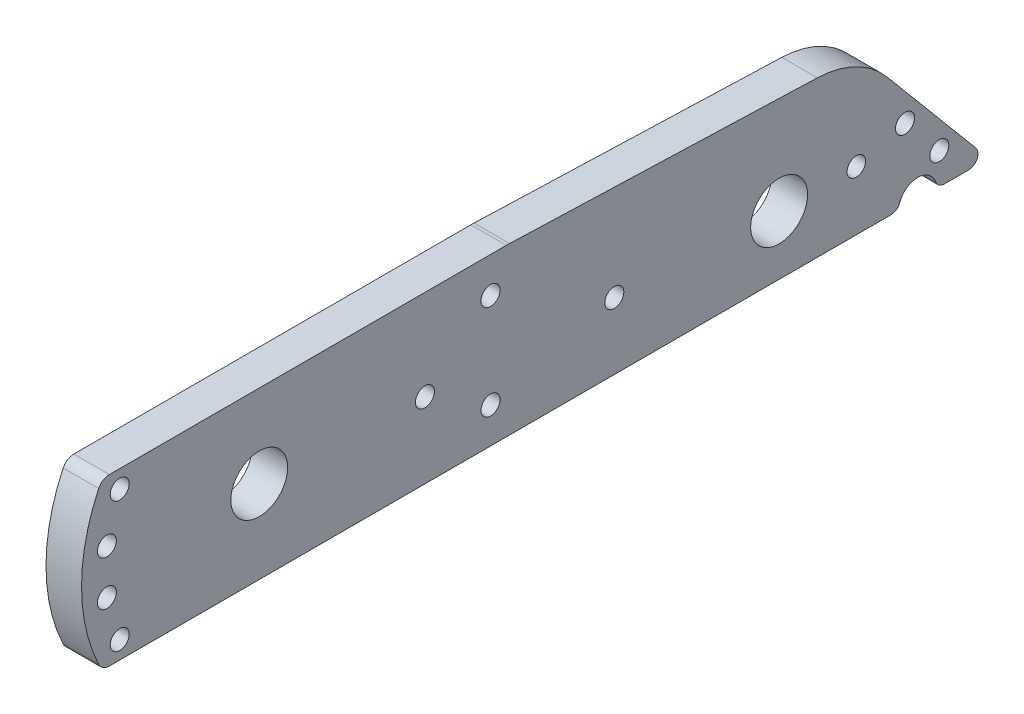
ISO-10303-21;
HEADER;
FILE_DESCRIPTION(('STEP AP214'),'2;1');
FILE_NAME('part.step','',(''),(''),'','','');
FILE_SCHEMA(('AUTOMOTIVE_DESIGN { 1 0 10303 214 1 1 1 1 }'));
ENDSEC;
DATA;
#1=APPLICATION_CONTEXT('core data for automotive mechanical design processes');
#2=APPLICATION_PROTOCOL_DEFINITION('international standard','automotive_design',2000,#1);
#3=PRODUCT_CONTEXT('',#1,'mechanical');
#4=PRODUCT('Part','Part','',(#3));
#5=PRODUCT_RELATED_PRODUCT_CATEGORY('part','',(#4));
#6=PRODUCT_DEFINITION_FORMATION('','',#4);
#7=PRODUCT_DEFINITION_CONTEXT('part definition',#1,'design');
#8=PRODUCT_DEFINITION('design','',#6,#7);
#9=PRODUCT_DEFINITION_SHAPE('','',#8);
#10=(LENGTH_UNIT() NAMED_UNIT(*) SI_UNIT(.MILLI.,.METRE.));
#11=(NAMED_UNIT(*) PLANE_ANGLE_UNIT() SI_UNIT($,.RADIAN.));
#12=(NAMED_UNIT(*) SI_UNIT($,.STERADIAN.) SOLID_ANGLE_UNIT());
#13=UNCERTAINTY_MEASURE_WITH_UNIT(LENGTH_MEASURE(1.E-05),#10,'distance_accuracy_value','');
#14=(GEOMETRIC_REPRESENTATION_CONTEXT(3) GLOBAL_UNCERTAINTY_ASSIGNED_CONTEXT((#13)) GLOBAL_UNIT_ASSIGNED_CONTEXT((#10,
#11,#12)) REPRESENTATION_CONTEXT('',''));
#15=CARTESIAN_POINT('',(0.,0.,0.));
#16=DIRECTION('',(0.,0.,1.));
#17=DIRECTION('',(1.,0.,0.));
#18=AXIS2_PLACEMENT_3D('',#15,#16,#17);
#19=CARTESIAN_POINT('',(-4.7625,9.52500000000001,19.05));
#20=DIRECTION('',(0.,1.,0.));
#21=DIRECTION('',(0.,0.,1.));
#22=AXIS2_PLACEMENT_3D('',#19,#20,#21);
#23=PLANE('',#22);
#24=DIRECTION('',(0.,0.,1.));
#25=VECTOR('',#24,1.);
#26=CARTESIAN_POINT('',(-4.7625,9.52500000000001,-195.537119934818));
#27=LINE('',#26,#25);
#28=CARTESIAN_POINT('',(-4.7625,9.52500000000001,-169.287441577265));
#29=VERTEX_POINT('',#28);
#30=CARTESIAN_POINT('',(-4.7625,9.52500000000001,40.1609262841384));
#31=VERTEX_POINT('',#30);
#32=EDGE_CURVE('E184',#29,#31,#27,.T.);
#33=ORIENTED_EDGE('',*,*,#32,.F.);
#34=DIRECTION('',(1.,0.,0.));
#35=VECTOR('',#34,1.);
#36=CARTESIAN_POINT('',(-4.7625,9.52500000000001,-169.287441577265));
#37=LINE('',#36,#35);
#38=CARTESIAN_POINT('',(4.7625,9.52500000000001,-169.287441577265));
#39=VERTEX_POINT('',#38);
#40=EDGE_CURVE('E11',#29,#39,#37,.T.);
#41=ORIENTED_EDGE('',*,*,#40,.T.);
#42=DIRECTION('',(0.,0.,1.));
#43=VECTOR('',#42,1.);
#44=CARTESIAN_POINT('',(4.7625,9.52500000000001,19.05));
#45=LINE('',#44,#43);
#46=CARTESIAN_POINT('',(4.7625,9.52500000000001,40.1609262841384));
#47=VERTEX_POINT('',#46);
#48=EDGE_CURVE('E168',#39,#47,#45,.T.);
#49=ORIENTED_EDGE('',*,*,#48,.T.);
#50=DIRECTION('',(1.,0.,0.));
#51=VECTOR('',#50,1.);
#52=CARTESIAN_POINT('',(-4.7625,9.52500000000001,40.1609262841384));
#53=LINE('',#52,#51);
#54=EDGE_CURVE('E244',#47,#31,#53,.F.);
#55=ORIENTED_EDGE('',*,*,#54,.T.);
#56=EDGE_LOOP('',(#33,#41,#49,#55));
#57=FACE_BOUND('',#56,.T.);
#58=ADVANCED_FACE('F41',(#57),#23,.F.);
#59=CARTESIAN_POINT('',(-4.7625,31.75,0.));
#60=DIRECTION('',(1.,0.,0.));
#61=DIRECTION('',(0.,0.,-1.));
#62=AXIS2_PLACEMENT_3D('',#59,#60,#61);
#63=PLANE('',#62);
#64=CARTESIAN_POINT('',(-4.7625,49.2125,37.3990202913124));
#65=DIRECTION('',(-1.,0.,0.));
#66=DIRECTION('',(0.,0.,1.));
#67=AXIS2_PLACEMENT_3D('',#64,#65,#66);
#68=CIRCLE('',#67,2.54);
#69=CARTESIAN_POINT('',(-4.7625,49.2125,39.9390202913124));
#70=VERTEX_POINT('',#69);
#71=EDGE_CURVE('E214',#70,#70,#68,.T.);
#72=ORIENTED_EDGE('',*,*,#71,.F.);
#73=EDGE_LOOP('',(#72));
#74=FACE_BOUND('',#73,.T.);
#75=CARTESIAN_POINT('',(-4.7625,37.7389524788158,40.8381938044092));
#76=DIRECTION('',(-1.,0.,0.));
#77=DIRECTION('',(0.,0.,1.));
#78=AXIS2_PLACEMENT_3D('',#75,#76,#77);
#79=CIRCLE('',#78,2.54);
#80=CARTESIAN_POINT('',(-4.7625,37.7389524788158,43.3781938044092));
#81=VERTEX_POINT('',#80);
#82=EDGE_CURVE('E381',#81,#81,#79,.T.);
#83=ORIENTED_EDGE('',*,*,#82,.F.);
#84=EDGE_LOOP('',(#83));
#85=FACE_BOUND('',#84,.T.);
#86=CARTESIAN_POINT('',(-4.7625,25.7610475211842,40.8381938044092));
#87=DIRECTION('',(-1.,0.,0.));
#88=DIRECTION('',(0.,0.,1.));
#89=AXIS2_PLACEMENT_3D('',#86,#87,#88);
#90=CIRCLE('',#89,2.54);
#91=CARTESIAN_POINT('',(-4.7625,25.7610475211842,43.3781938044092));
#92=VERTEX_POINT('',#91);
#93=EDGE_CURVE('E376',#92,#92,#90,.T.);
#94=ORIENTED_EDGE('',*,*,#93,.F.);
#95=EDGE_LOOP('',(#94));
#96=FACE_BOUND('',#95,.T.);
#97=CARTESIAN_POINT('',(-4.7625,14.2875,37.3990202913124));
#98=DIRECTION('',(-1.,0.,0.));
#99=DIRECTION('',(0.,0.,1.));
#100=AXIS2_PLACEMENT_3D('',#97,#98,#99);
#101=CIRCLE('',#100,2.54);
#102=CARTESIAN_POINT('',(-4.7625,14.2875,39.9390202913124));
#103=VERTEX_POINT('',#102);
#104=EDGE_CURVE('E373',#103,#103,#101,.T.);
#105=ORIENTED_EDGE('',*,*,#104,.F.);
#106=EDGE_LOOP('',(#105));
#107=FACE_BOUND('',#106,.T.);
#108=CARTESIAN_POINT('',(-4.7625,28.8892429303716,-173.071588618471));
#109=DIRECTION('',(-1.,0.,0.));
#110=DIRECTION('',(0.,0.,1.));
#111=AXIS2_PLACEMENT_3D('',#108,#109,#110);
#112=CIRCLE('',#111,2.55269999999998);
#113=CARTESIAN_POINT('',(-4.7625,28.8892429303716,-170.518888618471));
#114=VERTEX_POINT('',#113);
#115=EDGE_CURVE('E206',#114,#114,#112,.T.);
#116=ORIENTED_EDGE('',*,*,#115,.F.);
#117=EDGE_LOOP('',(#116));
#118=FACE_BOUND('',#117,.T.);
#119=CARTESIAN_POINT('',(-4.7625,17.9443829493092,-182.255416591868));
#120=DIRECTION('',(-1.,0.,0.));
#121=DIRECTION('',(0.,0.,1.));
#122=AXIS2_PLACEMENT_3D('',#119,#120,#121);
#123=CIRCLE('',#122,2.5526999999999);
#124=CARTESIAN_POINT('',(-4.7625,17.9443829493092,-179.702716591868));
#125=VERTEX_POINT('',#124);
#126=EDGE_CURVE('E222',#125,#125,#123,.T.);
#127=ORIENTED_EDGE('',*,*,#126,.F.);
#128=EDGE_LOOP('',(#127));
#129=FACE_BOUND('',#128,.T.);
#130=CARTESIAN_POINT('',(-4.7625,29.7262338371881,-44.4039060277163));
#131=DIRECTION('',(-1.,0.,0.));
#132=DIRECTION('',(0.,0.,1.));
#133=AXIS2_PLACEMENT_3D('',#130,#131,#132);
#134=CIRCLE('',#133,2.5527);
#135=CARTESIAN_POINT('',(-4.7625,29.7262338371881,-41.8512060277163));
#136=VERTEX_POINT('',#135);
#137=EDGE_CURVE('E189',#136,#136,#134,.T.);
#138=ORIENTED_EDGE('',*,*,#137,.F.);
#139=EDGE_LOOP('',(#138));
#140=FACE_BOUND('',#139,.T.);
#141=CARTESIAN_POINT('',(-4.7625,27.413358222546,-95.1512272022492));
#142=DIRECTION('',(-1.,0.,0.));
#143=DIRECTION('',(0.,0.,1.));
#144=AXIS2_PLACEMENT_3D('',#141,#142,#143);
#145=CIRCLE('',#144,2.55270000000001);
#146=CARTESIAN_POINT('',(-4.7625,27.413358222546,-92.5985272022492));
#147=VERTEX_POINT('',#146);
#148=EDGE_CURVE('E392',#147,#147,#145,.T.);
#149=ORIENTED_EDGE('',*,*,#148,.F.);
#150=EDGE_LOOP('',(#149));
#151=FACE_BOUND('',#150,.T.);
#152=CARTESIAN_POINT('',(-4.7625,44.45,-61.9862019257977));
#153=DIRECTION('',(-1.,0.,0.));
#154=DIRECTION('',(0.,0.,1.));
#155=AXIS2_PLACEMENT_3D('',#152,#153,#154);
#156=CIRCLE('',#155,2.5527);
#157=CARTESIAN_POINT('',(-4.7625,44.45,-59.4335019257977));
#158=VERTEX_POINT('',#157);
#159=EDGE_CURVE('E395',#158,#158,#156,.T.);
#160=ORIENTED_EDGE('',*,*,#159,.F.);
#161=EDGE_LOOP('',(#160));
#162=FACE_BOUND('',#161,.T.);
#163=CARTESIAN_POINT('',(-4.7625,19.05,-61.9862019257977));
#164=DIRECTION('',(-1.,0.,0.));
#165=DIRECTION('',(0.,0.,1.));
#166=AXIS2_PLACEMENT_3D('',#163,#164,#165);
#167=CIRCLE('',#166,2.5527);
#168=CARTESIAN_POINT('',(-4.7625,19.05,-59.4335019257977));
#169=VERTEX_POINT('',#168);
#170=EDGE_CURVE('E398',#169,#169,#167,.T.);
#171=ORIENTED_EDGE('',*,*,#170,.F.);
#172=EDGE_LOOP('',(#171));
#173=FACE_BOUND('',#172,.T.);
#174=CARTESIAN_POINT('',(-4.7625,25.4,-160.02));
#175=DIRECTION('',(-1.,0.,0.));
#176=DIRECTION('',(0.,0.,1.));
#177=AXIS2_PLACEMENT_3D('',#174,#175,#176);
#178=CIRCLE('',#177,2.4892);
#179=CARTESIAN_POINT('',(-4.7625,25.4,-157.5308));
#180=VERTEX_POINT('',#179);
#181=EDGE_CURVE('E209',#180,#180,#178,.T.);
#182=ORIENTED_EDGE('',*,*,#181,.F.);
#183=EDGE_LOOP('',(#182));
#184=FACE_BOUND('',#183,.T.);
#185=CARTESIAN_POINT('',(-4.7625,9.52500000000001,-190.090072356724));
#186=VERTEX_POINT('',#185);
#187=CARTESIAN_POINT('',(-4.7625,9.52500000000001,-183.655851370976));
#188=VERTEX_POINT('',#187);
#189=EDGE_CURVE('E161',#186,#188,#27,.T.);
#190=ORIENTED_EDGE('',*,*,#189,.T.);
#191=CARTESIAN_POINT('',(-4.7625,12.065,-183.655851370976));
#192=DIRECTION('',(1.,0.,0.));
#193=DIRECTION('',(0.,0.,-1.));
#194=AXIS2_PLACEMENT_3D('',#191,#192,#193);
#195=CIRCLE('',#194,2.54);
#196=CARTESIAN_POINT('',(-4.7625,11.2183333333333,-181.261116405357));
#197=VERTEX_POINT('',#196);
#198=EDGE_CURVE('E269',#188,#197,#195,.F.);
#199=ORIENTED_EDGE('',*,*,#198,.T.);
#200=CARTESIAN_POINT('',(-4.7625,9.52500000000001,-176.47164647412));
#201=DIRECTION('',(1.,0.,0.));
#202=DIRECTION('',(0.,0.,-1.));
#203=AXIS2_PLACEMENT_3D('',#200,#201,#202);
#204=CIRCLE('',#203,5.07999999999999);
#205=CARTESIAN_POINT('',(-4.7625,11.2183333333333,-171.682176542884));
#206=VERTEX_POINT('',#205);
#207=EDGE_CURVE('E281',#197,#206,#204,.T.);
#208=ORIENTED_EDGE('',*,*,#207,.T.);
#209=CARTESIAN_POINT('',(-4.7625,12.065,-169.287441577265));
#210=DIRECTION('',(1.,0.,0.));
#211=DIRECTION('',(0.,0.,-1.));
#212=AXIS2_PLACEMENT_3D('',#209,#210,#211);
#213=CIRCLE('',#212,2.54);
#214=EDGE_CURVE('E267',#206,#29,#213,.F.);
#215=ORIENTED_EDGE('',*,*,#214,.T.);
#216=ORIENTED_EDGE('',*,*,#32,.T.);
#217=CARTESIAN_POINT('',(-4.7625,12.7,40.1609262841384));
#218=DIRECTION('',(1.,0.,0.));
#219=DIRECTION('',(0.,0.,-1.));
#220=AXIS2_PLACEMENT_3D('',#217,#218,#219);
#221=CIRCLE('',#220,3.175);
#222=CARTESIAN_POINT('',(-4.7625,11.3392857142857,43.0295638758626));
#223=VERTEX_POINT('',#222);
#224=EDGE_CURVE('E240',#31,#223,#221,.F.);
#225=ORIENTED_EDGE('',*,*,#224,.T.);
#226=CARTESIAN_POINT('',(-4.7625,31.75,0.));
#227=DIRECTION('',(-1.,0.,0.));
#228=DIRECTION('',(0.,0.,-1.));
#229=AXIS2_PLACEMENT_3D('',#226,#227,#228);
#230=CIRCLE('',#229,47.625);
#231=CARTESIAN_POINT('',(-4.7625,52.1607142857143,43.0295638758626));
#232=VERTEX_POINT('',#231);
#233=EDGE_CURVE('E288',#223,#232,#230,.T.);
#234=ORIENTED_EDGE('',*,*,#233,.T.);
#235=CARTESIAN_POINT('',(-4.7625,50.8,40.1609262841384));
#236=DIRECTION('',(1.,0.,0.));
#237=DIRECTION('',(0.,0.,-1.));
#238=AXIS2_PLACEMENT_3D('',#235,#236,#237);
#239=CIRCLE('',#238,3.175);
#240=CARTESIAN_POINT('',(-4.7625,53.975,40.1609262841384));
#241=VERTEX_POINT('',#240);
#242=EDGE_CURVE('E242',#232,#241,#239,.F.);
#243=ORIENTED_EDGE('',*,*,#242,.T.);
#244=DIRECTION('',(0.,0.,-1.));
#245=VECTOR('',#244,1.);
#246=CARTESIAN_POINT('',(-4.7625,53.975,19.05));
#247=LINE('',#246,#245);
#248=CARTESIAN_POINT('',(-4.7625,53.975,-66.2471978534933));
#249=VERTEX_POINT('',#248);
#250=EDGE_CURVE('E291',#241,#249,#247,.T.);
#251=ORIENTED_EDGE('',*,*,#250,.T.);
#252=CARTESIAN_POINT('',(-4.7625,28.575,-66.2471978534933));
#253=DIRECTION('',(1.,0.,0.));
#254=DIRECTION('',(0.,0.,-1.));
#255=AXIS2_PLACEMENT_3D('',#252,#253,#254);
#256=CIRCLE('',#255,25.4);
#257=CARTESIAN_POINT('',(-4.7625,53.9605934822915,-67.102559503231));
#258=VERTEX_POINT('',#257);
#259=EDGE_CURVE('E259',#249,#258,#256,.F.);
#260=ORIENTED_EDGE('',*,*,#259,.T.);
#261=DIRECTION('',(0.,-0.0336756555014838,-0.999432814263443));
#262=VECTOR('',#261,1.);
#263=CARTESIAN_POINT('',(-4.7625,50.8,-160.903282657976));
#264=LINE('',#263,#262);
#265=CARTESIAN_POINT('',(-4.7625,51.181459251911,-149.582258969293));
#266=VERTEX_POINT('',#265);
#267=EDGE_CURVE('E298',#258,#266,#264,.T.);
#268=ORIENTED_EDGE('',*,*,#267,.T.);
#269=CARTESIAN_POINT('',(-4.7625,25.7958657696195,-148.726897319555));
#270=DIRECTION('',(1.,0.,0.));
#271=DIRECTION('',(0.,0.,-1.));
#272=AXIS2_PLACEMENT_3D('',#269,#270,#271);
#273=CIRCLE('',#272,25.4);
#274=CARTESIAN_POINT('',(-4.7625,42.1226710556577,-168.184426174777));
#275=VERTEX_POINT('',#274);
#276=EDGE_CURVE('E261',#266,#275,#273,.F.);
#277=ORIENTED_EDGE('',*,*,#276,.T.);
#278=DIRECTION('',(0.,-0.766044443118974,-0.642787609686544));
#279=VECTOR('',#278,1.);
#280=CARTESIAN_POINT('',(-4.7625,9.52500000000001,-195.537119934818));
#281=LINE('',#280,#279);
#282=CARTESIAN_POINT('',(-4.7625,13.6976805286038,-192.035825242246));
#283=VERTEX_POINT('',#282);
#284=EDGE_CURVE('E162',#275,#283,#281,.T.);
#285=ORIENTED_EDGE('',*,*,#284,.T.);
#286=CARTESIAN_POINT('',(-4.7625,12.065,-190.090072356724));
#287=DIRECTION('',(1.,0.,0.));
#288=DIRECTION('',(0.,0.,-1.));
#289=AXIS2_PLACEMENT_3D('',#286,#287,#288);
#290=CIRCLE('',#289,2.54);
#291=EDGE_CURVE('E225',#283,#186,#290,.F.);
#292=ORIENTED_EDGE('',*,*,#291,.T.);
#293=EDGE_LOOP('',(#190,#199,#208,#215,#216,#225,#234,#243,#251,#260,#268,#277,#285,#292));
#294=FACE_BOUND('',#293,.T.);
#295=CARTESIAN_POINT('',(-4.7625,31.75,0.));
#296=DIRECTION('',(-1.,0.,0.));
#297=DIRECTION('',(0.,0.,1.));
#298=AXIS2_PLACEMENT_3D('',#295,#296,#297);
#299=CIRCLE('',#298,7.62);
#300=CARTESIAN_POINT('',(-4.7625,31.75,-7.62));
#301=VERTEX_POINT('',#300);
#302=EDGE_CURVE('E173',#301,#301,#299,.T.);
#303=ORIENTED_EDGE('',*,*,#302,.F.);
#304=EDGE_LOOP('',(#303));
#305=FACE_BOUND('',#304,.T.);
#306=CARTESIAN_POINT('',(-4.7625,25.4,-139.32677028468));
#307=DIRECTION('',(-1.,0.,0.));
#308=DIRECTION('',(0.,0.,1.));
#309=AXIS2_PLACEMENT_3D('',#306,#307,#308);
#310=CIRCLE('',#309,7.62);
#311=CARTESIAN_POINT('',(-4.7625,25.4,-146.94677028468));
#312=VERTEX_POINT('',#311);
#313=EDGE_CURVE('E403',#312,#312,#310,.T.);
#314=ORIENTED_EDGE('',*,*,#313,.F.);
#315=EDGE_LOOP('',(#314));
#316=FACE_BOUND('',#315,.T.);
#317=ADVANCED_FACE('F286',(#74,#85,#96,#107,#118,#129,#140,#151,#162,#173,#184,#294,#305,#316),
#63,.F.);
#318=CARTESIAN_POINT('',(4.7625,31.75,0.));
#319=DIRECTION('',(1.,0.,0.));
#320=DIRECTION('',(0.,0.,-1.));
#321=AXIS2_PLACEMENT_3D('',#318,#319,#320);
#322=PLANE('',#321);
#323=CARTESIAN_POINT('',(4.7625,9.52500000000001,-176.47164647412));
#324=DIRECTION('',(1.,0.,0.));
#325=DIRECTION('',(0.,0.,-1.));
#326=AXIS2_PLACEMENT_3D('',#323,#324,#325);
#327=CIRCLE('',#326,5.07999999999999);
#328=CARTESIAN_POINT('',(4.7625,11.2183333333333,-181.261116405357));
#329=VERTEX_POINT('',#328);
#330=CARTESIAN_POINT('',(4.7625,11.2183333333333,-171.682176542884));
#331=VERTEX_POINT('',#330);
#332=EDGE_CURVE('E279',#329,#331,#327,.T.);
#333=ORIENTED_EDGE('',*,*,#332,.F.);
#334=CARTESIAN_POINT('',(4.7625,12.065,-183.655851370976));
#335=DIRECTION('',(1.,0.,0.));
#336=DIRECTION('',(0.,0.,-1.));
#337=AXIS2_PLACEMENT_3D('',#334,#335,#336);
#338=CIRCLE('',#337,2.54);
#339=CARTESIAN_POINT('',(4.7625,9.52500000000001,-183.655851370976));
#340=VERTEX_POINT('',#339);
#341=EDGE_CURVE('E49',#329,#340,#338,.T.);
#342=ORIENTED_EDGE('',*,*,#341,.T.);
#343=CARTESIAN_POINT('',(4.7625,9.52500000000001,-190.090072356724));
#344=VERTEX_POINT('',#343);
#345=EDGE_CURVE('E158',#344,#340,#45,.T.);
#346=ORIENTED_EDGE('',*,*,#345,.F.);
#347=CARTESIAN_POINT('',(4.7625,12.065,-190.090072356724));
#348=DIRECTION('',(1.,0.,0.));
#349=DIRECTION('',(0.,0.,-1.));
#350=AXIS2_PLACEMENT_3D('',#347,#348,#349);
#351=CIRCLE('',#350,2.54);
#352=CARTESIAN_POINT('',(4.7625,13.6976805286038,-192.035825242246));
#353=VERTEX_POINT('',#352);
#354=EDGE_CURVE('E143',#344,#353,#351,.T.);
#355=ORIENTED_EDGE('',*,*,#354,.T.);
#356=DIRECTION('',(0.,-0.766044443118974,-0.642787609686544));
#357=VECTOR('',#356,1.);
#358=CARTESIAN_POINT('',(4.7625,9.52500000000001,-195.537119934818));
#359=LINE('',#358,#357);
#360=CARTESIAN_POINT('',(4.7625,42.1226710556577,-168.184426174777));
#361=VERTEX_POINT('',#360);
#362=EDGE_CURVE('E182',#361,#353,#359,.T.);
#363=ORIENTED_EDGE('',*,*,#362,.F.);
#364=CARTESIAN_POINT('',(4.7625,25.7958657696195,-148.726897319555));
#365=DIRECTION('',(1.,0.,0.));
#366=DIRECTION('',(0.,0.,-1.));
#367=AXIS2_PLACEMENT_3D('',#364,#365,#366);
#368=CIRCLE('',#367,25.4);
#369=CARTESIAN_POINT('',(4.7625,51.181459251911,-149.582258969293));
#370=VERTEX_POINT('',#369);
#371=EDGE_CURVE('E252',#361,#370,#368,.T.);
#372=ORIENTED_EDGE('',*,*,#371,.T.);
#373=DIRECTION('',(0.,-0.0336756555014838,-0.999432814263443));
#374=VECTOR('',#373,1.);
#375=CARTESIAN_POINT('',(4.7625,50.8,-160.903282657976));
#376=LINE('',#375,#374);
#377=CARTESIAN_POINT('',(4.7625,53.9605934822915,-67.102559503231));
#378=VERTEX_POINT('',#377);
#379=EDGE_CURVE('E179',#378,#370,#376,.T.);
#380=ORIENTED_EDGE('',*,*,#379,.F.);
#381=CARTESIAN_POINT('',(4.7625,28.575,-66.2471978534933));
#382=DIRECTION('',(1.,0.,0.));
#383=DIRECTION('',(0.,0.,-1.));
#384=AXIS2_PLACEMENT_3D('',#381,#382,#383);
#385=CIRCLE('',#384,25.4);
#386=CARTESIAN_POINT('',(4.7625,53.975,-66.2471978534933));
#387=VERTEX_POINT('',#386);
#388=EDGE_CURVE('E250',#378,#387,#385,.T.);
#389=ORIENTED_EDGE('',*,*,#388,.T.);
#390=DIRECTION('',(0.,0.,-1.));
#391=VECTOR('',#390,1.);
#392=CARTESIAN_POINT('',(4.7625,53.975,-66.675));
#393=LINE('',#392,#391);
#394=CARTESIAN_POINT('',(4.7625,53.975,40.1609262841384));
#395=VERTEX_POINT('',#394);
#396=EDGE_CURVE('E171',#395,#387,#393,.T.);
#397=ORIENTED_EDGE('',*,*,#396,.F.);
#398=CARTESIAN_POINT('',(4.7625,50.8,40.1609262841384));
#399=DIRECTION('',(1.,0.,0.));
#400=DIRECTION('',(0.,0.,-1.));
#401=AXIS2_PLACEMENT_3D('',#398,#399,#400);
#402=CIRCLE('',#401,3.175);
#403=CARTESIAN_POINT('',(4.7625,52.1607142857143,43.0295638758626));
#404=VERTEX_POINT('',#403);
#405=EDGE_CURVE('E233',#395,#404,#402,.T.);
#406=ORIENTED_EDGE('',*,*,#405,.T.);
#407=CARTESIAN_POINT('',(4.7625,31.75,0.));
#408=DIRECTION('',(-1.,0.,0.));
#409=DIRECTION('',(0.,0.,-1.));
#410=AXIS2_PLACEMENT_3D('',#407,#408,#409);
#411=CIRCLE('',#410,47.625);
#412=CARTESIAN_POINT('',(4.7625,11.3392857142857,43.0295638758626));
#413=VERTEX_POINT('',#412);
#414=EDGE_CURVE('E167',#413,#404,#411,.T.);
#415=ORIENTED_EDGE('',*,*,#414,.F.);
#416=CARTESIAN_POINT('',(4.7625,12.7,40.1609262841384));
#417=DIRECTION('',(1.,0.,0.));
#418=DIRECTION('',(0.,0.,-1.));
#419=AXIS2_PLACEMENT_3D('',#416,#417,#418);
#420=CIRCLE('',#419,3.175);
#421=EDGE_CURVE('E230',#413,#47,#420,.T.);
#422=ORIENTED_EDGE('',*,*,#421,.T.);
#423=ORIENTED_EDGE('',*,*,#48,.F.);
#424=CARTESIAN_POINT('',(4.7625,12.065,-169.287441577265));
#425=DIRECTION('',(1.,0.,0.));
#426=DIRECTION('',(0.,0.,-1.));
#427=AXIS2_PLACEMENT_3D('',#424,#425,#426);
#428=CIRCLE('',#427,2.54);
#429=EDGE_CURVE('E56',#39,#331,#428,.T.);
#430=ORIENTED_EDGE('',*,*,#429,.T.);
#431=EDGE_LOOP('',(#333,#342,#346,#355,#363,#372,#380,#389,#397,#406,#415,#422,#423,#430));
#432=FACE_BOUND('',#431,.T.);
#433=CARTESIAN_POINT('',(4.7625,49.2125,37.3990202913124));
#434=DIRECTION('',(1.,0.,0.));
#435=DIRECTION('',(0.,0.,-1.));
#436=AXIS2_PLACEMENT_3D('',#433,#434,#435);
#437=CIRCLE('',#436,2.54);
#438=CARTESIAN_POINT('',(4.7625,49.2125,34.8590202913124));
#439=VERTEX_POINT('',#438);
#440=EDGE_CURVE('E220',#439,#439,#437,.T.);
#441=ORIENTED_EDGE('',*,*,#440,.F.);
#442=EDGE_LOOP('',(#441));
#443=FACE_BOUND('',#442,.T.);
#444=CARTESIAN_POINT('',(4.7625,37.7389524788158,40.8381938044092));
#445=DIRECTION('',(1.,0.,0.));
#446=DIRECTION('',(0.,0.,-1.));
#447=AXIS2_PLACEMENT_3D('',#444,#445,#446);
#448=CIRCLE('',#447,2.54);
#449=CARTESIAN_POINT('',(4.7625,37.7389524788158,38.2981938044092));
#450=VERTEX_POINT('',#449);
#451=EDGE_CURVE('E217',#450,#450,#448,.T.);
#452=ORIENTED_EDGE('',*,*,#451,.F.);
#453=EDGE_LOOP('',(#452));
#454=FACE_BOUND('',#453,.T.);
#455=CARTESIAN_POINT('',(4.7625,25.7610475211842,40.8381938044092));
#456=DIRECTION('',(1.,0.,0.));
#457=DIRECTION('',(0.,0.,-1.));
#458=AXIS2_PLACEMENT_3D('',#455,#456,#457);
#459=CIRCLE('',#458,2.54);
#460=CARTESIAN_POINT('',(4.7625,25.7610475211842,38.2981938044092));
#461=VERTEX_POINT('',#460);
#462=EDGE_CURVE('E213',#461,#461,#459,.T.);
#463=ORIENTED_EDGE('',*,*,#462,.F.);
#464=EDGE_LOOP('',(#463));
#465=FACE_BOUND('',#464,.T.);
#466=CARTESIAN_POINT('',(4.7625,14.2875,37.3990202913124));
#467=DIRECTION('',(1.,0.,0.));
#468=DIRECTION('',(0.,0.,-1.));
#469=AXIS2_PLACEMENT_3D('',#466,#467,#468);
#470=CIRCLE('',#469,2.54);
#471=CARTESIAN_POINT('',(4.7625,14.2875,34.8590202913124));
#472=VERTEX_POINT('',#471);
#473=EDGE_CURVE('E210',#472,#472,#470,.T.);
#474=ORIENTED_EDGE('',*,*,#473,.F.);
#475=EDGE_LOOP('',(#474));
#476=FACE_BOUND('',#475,.T.);
#477=CARTESIAN_POINT('',(4.7625,28.8892429303716,-173.071588618471));
#478=DIRECTION('',(1.,0.,0.));
#479=DIRECTION('',(0.,0.,-1.));
#480=AXIS2_PLACEMENT_3D('',#477,#478,#479);
#481=CIRCLE('',#480,2.55269999999998);
#482=CARTESIAN_POINT('',(4.7625,28.8892429303716,-175.624288618471));
#483=VERTEX_POINT('',#482);
#484=EDGE_CURVE('E205',#483,#483,#481,.T.);
#485=ORIENTED_EDGE('',*,*,#484,.F.);
#486=EDGE_LOOP('',(#485));
#487=FACE_BOUND('',#486,.T.);
#488=CARTESIAN_POINT('',(4.7625,17.9443829493092,-182.255416591868));
#489=DIRECTION('',(1.,0.,0.));
#490=DIRECTION('',(0.,0.,-1.));
#491=AXIS2_PLACEMENT_3D('',#488,#489,#490);
#492=CIRCLE('',#491,2.5526999999999);
#493=CARTESIAN_POINT('',(4.7625,17.9443829493092,-184.808116591868));
#494=VERTEX_POINT('',#493);
#495=EDGE_CURVE('E202',#494,#494,#492,.T.);
#496=ORIENTED_EDGE('',*,*,#495,.F.);
#497=EDGE_LOOP('',(#496));
#498=FACE_BOUND('',#497,.T.);
#499=CARTESIAN_POINT('',(4.7625,29.7262338371881,-44.4039060277163));
#500=DIRECTION('',(1.,0.,0.));
#501=DIRECTION('',(0.,0.,-1.));
#502=AXIS2_PLACEMENT_3D('',#499,#500,#501);
#503=CIRCLE('',#502,2.5527);
#504=CARTESIAN_POINT('',(4.7625,29.7262338371881,-46.9566060277163));
#505=VERTEX_POINT('',#504);
#506=EDGE_CURVE('E198',#505,#505,#503,.T.);
#507=ORIENTED_EDGE('',*,*,#506,.F.);
#508=EDGE_LOOP('',(#507));
#509=FACE_BOUND('',#508,.T.);
#510=CARTESIAN_POINT('',(4.7625,27.413358222546,-95.1512272022492));
#511=DIRECTION('',(1.,0.,0.));
#512=DIRECTION('',(0.,0.,-1.));
#513=AXIS2_PLACEMENT_3D('',#510,#511,#512);
#514=CIRCLE('',#513,2.55270000000001);
#515=CARTESIAN_POINT('',(4.7625,27.413358222546,-97.7039272022492));
#516=VERTEX_POINT('',#515);
#517=EDGE_CURVE('E195',#516,#516,#514,.T.);
#518=ORIENTED_EDGE('',*,*,#517,.F.);
#519=EDGE_LOOP('',(#518));
#520=FACE_BOUND('',#519,.T.);
#521=CARTESIAN_POINT('',(4.7625,44.45,-61.9862019257977));
#522=DIRECTION('',(1.,0.,0.));
#523=DIRECTION('',(0.,0.,-1.));
#524=AXIS2_PLACEMENT_3D('',#521,#522,#523);
#525=CIRCLE('',#524,2.5527);
#526=CARTESIAN_POINT('',(4.7625,44.45,-64.5389019257977));
#527=VERTEX_POINT('',#526);
#528=EDGE_CURVE('E192',#527,#527,#525,.T.);
#529=ORIENTED_EDGE('',*,*,#528,.F.);
#530=EDGE_LOOP('',(#529));
#531=FACE_BOUND('',#530,.T.);
#532=CARTESIAN_POINT('',(4.7625,19.05,-61.9862019257977));
#533=DIRECTION('',(1.,0.,0.));
#534=DIRECTION('',(0.,0.,-1.));
#535=AXIS2_PLACEMENT_3D('',#532,#533,#534);
#536=CIRCLE('',#535,2.5527);
#537=CARTESIAN_POINT('',(4.7625,19.05,-64.5389019257977));
#538=VERTEX_POINT('',#537);
#539=EDGE_CURVE('E188',#538,#538,#536,.T.);
#540=ORIENTED_EDGE('',*,*,#539,.F.);
#541=EDGE_LOOP('',(#540));
#542=FACE_BOUND('',#541,.T.);
#543=CARTESIAN_POINT('',(4.7625,25.4,-160.02));
#544=DIRECTION('',(1.,0.,0.));
#545=DIRECTION('',(0.,0.,-1.));
#546=AXIS2_PLACEMENT_3D('',#543,#544,#545);
#547=CIRCLE('',#546,2.4892);
#548=CARTESIAN_POINT('',(4.7625,25.4,-162.5092));
#549=VERTEX_POINT('',#548);
#550=EDGE_CURVE('E185',#549,#549,#547,.T.);
#551=ORIENTED_EDGE('',*,*,#550,.F.);
#552=EDGE_LOOP('',(#551));
#553=FACE_BOUND('',#552,.T.);
#554=CARTESIAN_POINT('',(4.7625,31.75,0.));
#555=DIRECTION('',(-1.,0.,0.));
#556=DIRECTION('',(0.,0.,1.));
#557=AXIS2_PLACEMENT_3D('',#554,#555,#556);
#558=CIRCLE('',#557,7.62);
#559=CARTESIAN_POINT('',(4.7625,31.75,-7.62));
#560=VERTEX_POINT('',#559);
#561=EDGE_CURVE('E294',#560,#560,#558,.T.);
#562=ORIENTED_EDGE('',*,*,#561,.T.);
#563=EDGE_LOOP('',(#562));
#564=FACE_BOUND('',#563,.T.);
#565=CARTESIAN_POINT('',(4.7625,25.4,-139.32677028468));
#566=DIRECTION('',(-1.,0.,0.));
#567=DIRECTION('',(0.,0.,1.));
#568=AXIS2_PLACEMENT_3D('',#565,#566,#567);
#569=CIRCLE('',#568,7.62);
#570=CARTESIAN_POINT('',(4.7625,25.4,-146.94677028468));
#571=VERTEX_POINT('',#570);
#572=EDGE_CURVE('E201',#571,#571,#569,.T.);
#573=ORIENTED_EDGE('',*,*,#572,.T.);
#574=EDGE_LOOP('',(#573));
#575=FACE_BOUND('',#574,.T.);
#576=ADVANCED_FACE('F164',(#432,#443,#454,#465,#476,#487,#498,#509,#520,#531,#542,#553,#564,
#575),#322,.T.);
#577=ORIENTED_EDGE('',*,*,#345,.T.);
#578=DIRECTION('',(1.,0.,0.));
#579=VECTOR('',#578,1.);
#580=CARTESIAN_POINT('',(-4.7625,9.52500000000001,-183.655851370976));
#581=LINE('',#580,#579);
#582=EDGE_CURVE('E265',#340,#188,#581,.F.);
#583=ORIENTED_EDGE('',*,*,#582,.T.);
#584=ORIENTED_EDGE('',*,*,#189,.F.);
#585=DIRECTION('',(1.,0.,0.));
#586=VECTOR('',#585,1.);
#587=CARTESIAN_POINT('',(-4.7625,9.52500000000001,-190.090072356724));
#588=LINE('',#587,#586);
#589=EDGE_CURVE('E147',#186,#344,#588,.T.);
#590=ORIENTED_EDGE('',*,*,#589,.T.);
#591=EDGE_LOOP('',(#577,#583,#584,#590));
#592=FACE_BOUND('',#591,.T.);
#593=ADVANCED_FACE('F156',(#592),#23,.F.);
#594=CARTESIAN_POINT('',(-4.7625,31.75,0.));
#595=DIRECTION('',(1.,0.,0.));
#596=DIRECTION('',(0.,0.,-1.));
#597=AXIS2_PLACEMENT_3D('',#594,#595,#596);
#598=CYLINDRICAL_SURFACE('',#597,47.625);
#599=ORIENTED_EDGE('',*,*,#414,.T.);
#600=DIRECTION('',(1.,0.,0.));
#601=VECTOR('',#600,1.);
#602=CARTESIAN_POINT('',(-4.7625,52.1607142857143,43.0295638758626));
#603=LINE('',#602,#601);
#604=EDGE_CURVE('E238',#404,#232,#603,.F.);
#605=ORIENTED_EDGE('',*,*,#604,.T.);
#606=ORIENTED_EDGE('',*,*,#233,.F.);
#607=DIRECTION('',(1.,0.,0.));
#608=VECTOR('',#607,1.);
#609=CARTESIAN_POINT('',(-4.7625,11.3392857142857,43.0295638758626));
#610=LINE('',#609,#608);
#611=EDGE_CURVE('E235',#223,#413,#610,.T.);
#612=ORIENTED_EDGE('',*,*,#611,.T.);
#613=EDGE_LOOP('',(#599,#605,#606,#612));
#614=FACE_BOUND('',#613,.T.);
#615=ADVANCED_FACE('F338',(#614),#598,.T.);
#616=CARTESIAN_POINT('',(-4.7625,53.975,-66.675));
#617=DIRECTION('',(0.,-1.,0.));
#618=DIRECTION('',(0.,0.,-1.));
#619=AXIS2_PLACEMENT_3D('',#616,#617,#618);
#620=PLANE('',#619);
#621=ORIENTED_EDGE('',*,*,#396,.T.);
#622=DIRECTION('',(1.,0.,0.));
#623=VECTOR('',#622,1.);
#624=CARTESIAN_POINT('',(-4.7625,53.975,-66.2471978534933));
#625=LINE('',#624,#623);
#626=EDGE_CURVE('E263',#387,#249,#625,.F.);
#627=ORIENTED_EDGE('',*,*,#626,.T.);
#628=ORIENTED_EDGE('',*,*,#250,.F.);
#629=DIRECTION('',(1.,0.,0.));
#630=VECTOR('',#629,1.);
#631=CARTESIAN_POINT('',(-4.7625,53.975,40.1609262841384));
#632=LINE('',#631,#630);
#633=EDGE_CURVE('E227',#241,#395,#632,.T.);
#634=ORIENTED_EDGE('',*,*,#633,.T.);
#635=EDGE_LOOP('',(#621,#627,#628,#634));
#636=FACE_BOUND('',#635,.T.);
#637=ADVANCED_FACE('F343',(#636),#620,.F.);
#638=CARTESIAN_POINT('',(-4.7625,50.8,-160.903282657976));
#639=DIRECTION('',(0.,-0.999432814263443,0.0336756555014838));
#640=DIRECTION('',(0.,-0.0336756555014838,-0.999432814263443));
#641=AXIS2_PLACEMENT_3D('',#638,#639,#640);
#642=PLANE('',#641);
#643=ORIENTED_EDGE('',*,*,#379,.T.);
#644=DIRECTION('',(1.,0.,0.));
#645=VECTOR('',#644,1.);
#646=CARTESIAN_POINT('',(-4.7625,51.181459251911,-149.582258969293));
#647=LINE('',#646,#645);
#648=EDGE_CURVE('E257',#370,#266,#647,.F.);
#649=ORIENTED_EDGE('',*,*,#648,.T.);
#650=ORIENTED_EDGE('',*,*,#267,.F.);
#651=DIRECTION('',(1.,0.,0.));
#652=VECTOR('',#651,1.);
#653=CARTESIAN_POINT('',(-4.7625,53.9605934822915,-67.102559503231));
#654=LINE('',#653,#652);
#655=EDGE_CURVE('E254',#258,#378,#654,.T.);
#656=ORIENTED_EDGE('',*,*,#655,.T.);
#657=EDGE_LOOP('',(#643,#649,#650,#656));
#658=FACE_BOUND('',#657,.T.);
#659=ADVANCED_FACE('F310',(#658),#642,.F.);
#660=CARTESIAN_POINT('',(-4.7625,9.52500000000001,-195.537119934818));
#661=DIRECTION('',(0.,-0.642787609686544,0.766044443118974));
#662=DIRECTION('',(0.,-0.766044443118974,-0.642787609686544));
#663=AXIS2_PLACEMENT_3D('',#660,#661,#662);
#664=PLANE('',#663);
#665=ORIENTED_EDGE('',*,*,#284,.F.);
#666=DIRECTION('',(1.,0.,0.));
#667=VECTOR('',#666,1.);
#668=CARTESIAN_POINT('',(-4.7625,42.1226710556577,-168.184426174777));
#669=LINE('',#668,#667);
#670=EDGE_CURVE('E247',#275,#361,#669,.T.);
#671=ORIENTED_EDGE('',*,*,#670,.T.);
#672=ORIENTED_EDGE('',*,*,#362,.T.);
#673=DIRECTION('',(1.,0.,0.));
#674=VECTOR('',#673,1.);
#675=CARTESIAN_POINT('',(-4.7625,13.6976805286038,-192.035825242246));
#676=LINE('',#675,#674);
#677=EDGE_CURVE('E149',#353,#283,#676,.F.);
#678=ORIENTED_EDGE('',*,*,#677,.T.);
#679=EDGE_LOOP('',(#665,#671,#672,#678));
#680=FACE_BOUND('',#679,.T.);
#681=ADVANCED_FACE('F305',(#680),#664,.F.);
#682=CARTESIAN_POINT('',(-4.7625,31.75,0.));
#683=DIRECTION('',(1.,0.,0.));
#684=DIRECTION('',(0.,0.,-1.));
#685=AXIS2_PLACEMENT_3D('',#682,#683,#684);
#686=CYLINDRICAL_SURFACE('',#685,7.62);
#687=CARTESIAN_POINT('',(-4.7625,31.75,-7.62));
#688=CARTESIAN_POINT('',(-4.66328125,31.75,-7.62));
#689=CARTESIAN_POINT('',(-4.5640625,31.75,-7.62));
#690=CARTESIAN_POINT('',(-4.365625,31.75,-7.62));
#691=CARTESIAN_POINT('',(-4.26640625,31.75,-7.62));
#692=CARTESIAN_POINT('',(-4.06796875,31.75,-7.62));
#693=CARTESIAN_POINT('',(-3.96875,31.75,-7.62));
#694=CARTESIAN_POINT('',(-3.7703125,31.75,-7.62));
#695=CARTESIAN_POINT('',(-3.67109375,31.75,-7.62));
#696=CARTESIAN_POINT('',(-3.47265625,31.75,-7.62));
#697=CARTESIAN_POINT('',(-3.3734375,31.75,-7.62));
#698=CARTESIAN_POINT('',(-3.175,31.75,-7.62));
#699=CARTESIAN_POINT('',(-3.07578125,31.75,-7.62));
#700=CARTESIAN_POINT('',(-2.87734375,31.75,-7.62));
#701=CARTESIAN_POINT('',(-2.778125,31.75,-7.62));
#702=CARTESIAN_POINT('',(-2.5796875,31.75,-7.62));
#703=CARTESIAN_POINT('',(-2.48046875,31.75,-7.62));
#704=CARTESIAN_POINT('',(-2.28203125,31.75,-7.62));
#705=CARTESIAN_POINT('',(-2.1828125,31.75,-7.62));
#706=CARTESIAN_POINT('',(-1.984375,31.75,-7.62));
#707=CARTESIAN_POINT('',(-1.88515625,31.75,-7.62));
#708=CARTESIAN_POINT('',(-1.68671875,31.75,-7.62));
#709=CARTESIAN_POINT('',(-1.5875,31.75,-7.62));
#710=CARTESIAN_POINT('',(-1.3890625,31.75,-7.62));
#711=CARTESIAN_POINT('',(-1.28984375,31.75,-7.62));
#712=CARTESIAN_POINT('',(-1.09140625,31.75,-7.62));
#713=CARTESIAN_POINT('',(-0.992187499999999,31.75,-7.62));
#714=CARTESIAN_POINT('',(-0.793749999999999,31.75,-7.62));
#715=CARTESIAN_POINT('',(-0.694531249999999,31.75,-7.62));
#716=CARTESIAN_POINT('',(-0.496093749999999,31.75,-7.62));
#717=CARTESIAN_POINT('',(-0.396874999999999,31.75,-7.62));
#718=CARTESIAN_POINT('',(-0.198437499999999,31.75,-7.62));
#719=CARTESIAN_POINT('',(-0.0992187499999992,31.75,-7.62));
#720=CARTESIAN_POINT('',(0.0992187500000009,31.75,-7.62));
#721=CARTESIAN_POINT('',(0.198437500000001,31.75,-7.62));
#722=CARTESIAN_POINT('',(0.396875000000001,31.75,-7.62));
#723=CARTESIAN_POINT('',(0.496093750000001,31.75,-7.62));
#724=CARTESIAN_POINT('',(0.694531250000001,31.75,-7.62));
#725=CARTESIAN_POINT('',(0.793750000000001,31.75,-7.62));
#726=CARTESIAN_POINT('',(0.992187500000002,31.75,-7.62));
#727=CARTESIAN_POINT('',(1.09140625,31.75,-7.62));
#728=CARTESIAN_POINT('',(1.28984375,31.75,-7.62));
#729=CARTESIAN_POINT('',(1.3890625,31.75,-7.62));
#730=CARTESIAN_POINT('',(1.5875,31.75,-7.62));
#731=CARTESIAN_POINT('',(1.68671875,31.75,-7.62));
#732=CARTESIAN_POINT('',(1.88515625,31.75,-7.62));
#733=CARTESIAN_POINT('',(1.984375,31.75,-7.62));
#734=CARTESIAN_POINT('',(2.1828125,31.75,-7.62));
#735=CARTESIAN_POINT('',(2.28203125,31.75,-7.62));
#736=CARTESIAN_POINT('',(2.48046875,31.75,-7.62));
#737=CARTESIAN_POINT('',(2.5796875,31.75,-7.62));
#738=CARTESIAN_POINT('',(2.778125,31.75,-7.62));
#739=CARTESIAN_POINT('',(2.87734375,31.75,-7.62));
#740=CARTESIAN_POINT('',(3.07578125,31.75,-7.62));
#741=CARTESIAN_POINT('',(3.175,31.75,-7.62));
#742=CARTESIAN_POINT('',(3.3734375,31.75,-7.62));
#743=CARTESIAN_POINT('',(3.47265625,31.75,-7.62));
#744=CARTESIAN_POINT('',(3.67109375,31.75,-7.62));
#745=CARTESIAN_POINT('',(3.7703125,31.75,-7.62));
#746=CARTESIAN_POINT('',(3.96875,31.75,-7.62));
#747=CARTESIAN_POINT('',(4.06796875,31.75,-7.62));
#748=CARTESIAN_POINT('',(4.26640625,31.75,-7.62));
#749=CARTESIAN_POINT('',(4.365625,31.75,-7.62));
#750=CARTESIAN_POINT('',(4.5640625,31.75,-7.62));
#751=CARTESIAN_POINT('',(4.66328125,31.75,-7.62));
#752=CARTESIAN_POINT('',(4.7625,31.75,-7.62));
#753=B_SPLINE_CURVE_WITH_KNOTS('',3,(#687,#688,#689,#690,#691,#692,#693,#694,#695,#696,#697,
#698,#699,#700,#701,#702,#703,#704,#705,#706,#707,#708,#709,#710,#711,#712,#713,#714,#715,#716,
#717,#718,#719,#720,#721,#722,#723,#724,#725,#726,#727,#728,#729,#730,#731,#732,#733,#734,#735,
#736,#737,#738,#739,#740,#741,#742,#743,#744,#745,#746,#747,#748,#749,#750,#751,#752),
.UNSPECIFIED.,.F.,.F.,(4,2,2,2,2,2,2,2,2,2,2,2,2,2,2,2,2,2,2,2,2,2,2,2,2,2,2,2,2,2,2,2,4),(0.,
0.297656250000001,0.595312500000001,0.892968750000001,1.190625,1.48828125,1.7859375,2.08359375,
2.38125,2.67890625,2.9765625,3.27421875,3.571875,3.86953125,4.1671875,4.46484375,4.7625,
5.06015625,5.3578125,5.65546875,5.953125,6.25078125000001,6.54843750000001,6.84609375000001,
7.14375000000001,7.44140625000001,7.73906250000001,8.03671875000001,8.33437500000001,
8.63203125000001,8.92968750000001,9.22734375000001,9.52500000000001),.UNSPECIFIED.);
#754=EDGE_CURVE('BSEAM352',#301,#560,#753,.T.);
#755=ORIENTED_EDGE('',*,*,#302,.T.);
#756=ORIENTED_EDGE('',*,*,#561,.F.);
#757=ORIENTED_EDGE('',*,*,#754,.T.);
#758=ORIENTED_EDGE('',*,*,#754,.F.);
#759=EDGE_LOOP('',(#755,#757,#756,#758));
#760=FACE_BOUND('',#759,.T.);
#761=ADVANCED_FACE('F352',(#760),#686,.F.);
#762=CARTESIAN_POINT('',(-4.7625,25.4,-139.32677028468));
#763=DIRECTION('',(1.,0.,0.));
#764=DIRECTION('',(0.,0.,-1.));
#765=AXIS2_PLACEMENT_3D('',#762,#763,#764);
#766=CYLINDRICAL_SURFACE('',#765,7.62);
#767=CARTESIAN_POINT('',(-4.7625,25.4,-146.94677028468));
#768=CARTESIAN_POINT('',(-4.66328125,25.4,-146.94677028468));
#769=CARTESIAN_POINT('',(-4.5640625,25.4,-146.94677028468));
#770=CARTESIAN_POINT('',(-4.365625,25.4,-146.94677028468));
#771=CARTESIAN_POINT('',(-4.26640625,25.4,-146.94677028468));
#772=CARTESIAN_POINT('',(-4.06796875,25.4,-146.94677028468));
#773=CARTESIAN_POINT('',(-3.96875,25.4,-146.94677028468));
#774=CARTESIAN_POINT('',(-3.7703125,25.4,-146.94677028468));
#775=CARTESIAN_POINT('',(-3.67109375,25.4,-146.94677028468));
#776=CARTESIAN_POINT('',(-3.47265625,25.4,-146.94677028468));
#777=CARTESIAN_POINT('',(-3.3734375,25.4,-146.94677028468));
#778=CARTESIAN_POINT('',(-3.175,25.4,-146.94677028468));
#779=CARTESIAN_POINT('',(-3.07578125,25.4,-146.94677028468));
#780=CARTESIAN_POINT('',(-2.87734375,25.4,-146.94677028468));
#781=CARTESIAN_POINT('',(-2.778125,25.4,-146.94677028468));
#782=CARTESIAN_POINT('',(-2.5796875,25.4,-146.94677028468));
#783=CARTESIAN_POINT('',(-2.48046875,25.4,-146.94677028468));
#784=CARTESIAN_POINT('',(-2.28203125,25.4,-146.94677028468));
#785=CARTESIAN_POINT('',(-2.1828125,25.4,-146.94677028468));
#786=CARTESIAN_POINT('',(-1.984375,25.4,-146.94677028468));
#787=CARTESIAN_POINT('',(-1.88515625,25.4,-146.94677028468));
#788=CARTESIAN_POINT('',(-1.68671875,25.4,-146.94677028468));
#789=CARTESIAN_POINT('',(-1.5875,25.4,-146.94677028468));
#790=CARTESIAN_POINT('',(-1.3890625,25.4,-146.94677028468));
#791=CARTESIAN_POINT('',(-1.28984375,25.4,-146.94677028468));
#792=CARTESIAN_POINT('',(-1.09140625,25.4,-146.94677028468));
#793=CARTESIAN_POINT('',(-0.992187499999999,25.4,-146.94677028468));
#794=CARTESIAN_POINT('',(-0.793749999999999,25.4,-146.94677028468));
#795=CARTESIAN_POINT('',(-0.694531249999999,25.4,-146.94677028468));
#796=CARTESIAN_POINT('',(-0.496093749999999,25.4,-146.94677028468));
#797=CARTESIAN_POINT('',(-0.396874999999999,25.4,-146.94677028468));
#798=CARTESIAN_POINT('',(-0.198437499999999,25.4,-146.94677028468));
#799=CARTESIAN_POINT('',(-0.0992187499999992,25.4,-146.94677028468));
#800=CARTESIAN_POINT('',(0.0992187500000009,25.4,-146.94677028468));
#801=CARTESIAN_POINT('',(0.198437500000001,25.4,-146.94677028468));
#802=CARTESIAN_POINT('',(0.396875000000001,25.4,-146.94677028468));
#803=CARTESIAN_POINT('',(0.496093750000001,25.4,-146.94677028468));
#804=CARTESIAN_POINT('',(0.694531250000001,25.4,-146.94677028468));
#805=CARTESIAN_POINT('',(0.793750000000001,25.4,-146.94677028468));
#806=CARTESIAN_POINT('',(0.992187500000002,25.4,-146.94677028468));
#807=CARTESIAN_POINT('',(1.09140625,25.4,-146.94677028468));
#808=CARTESIAN_POINT('',(1.28984375,25.4,-146.94677028468));
#809=CARTESIAN_POINT('',(1.3890625,25.4,-146.94677028468));
#810=CARTESIAN_POINT('',(1.5875,25.4,-146.94677028468));
#811=CARTESIAN_POINT('',(1.68671875,25.4,-146.94677028468));
#812=CARTESIAN_POINT('',(1.88515625,25.4,-146.94677028468));
#813=CARTESIAN_POINT('',(1.984375,25.4,-146.94677028468));
#814=CARTESIAN_POINT('',(2.1828125,25.4,-146.94677028468));
#815=CARTESIAN_POINT('',(2.28203125,25.4,-146.94677028468));
#816=CARTESIAN_POINT('',(2.48046875,25.4,-146.94677028468));
#817=CARTESIAN_POINT('',(2.5796875,25.4,-146.94677028468));
#818=CARTESIAN_POINT('',(2.778125,25.4,-146.94677028468));
#819=CARTESIAN_POINT('',(2.87734375,25.4,-146.94677028468));
#820=CARTESIAN_POINT('',(3.07578125,25.4,-146.94677028468));
#821=CARTESIAN_POINT('',(3.175,25.4,-146.94677028468));
#822=CARTESIAN_POINT('',(3.3734375,25.4,-146.94677028468));
#823=CARTESIAN_POINT('',(3.47265625,25.4,-146.94677028468));
#824=CARTESIAN_POINT('',(3.67109375,25.4,-146.94677028468));
#825=CARTESIAN_POINT('',(3.7703125,25.4,-146.94677028468));
#826=CARTESIAN_POINT('',(3.96875,25.4,-146.94677028468));
#827=CARTESIAN_POINT('',(4.06796875,25.4,-146.94677028468));
#828=CARTESIAN_POINT('',(4.26640625,25.4,-146.94677028468));
#829=CARTESIAN_POINT('',(4.365625,25.4,-146.94677028468));
#830=CARTESIAN_POINT('',(4.5640625,25.4,-146.94677028468));
#831=CARTESIAN_POINT('',(4.66328125,25.4,-146.94677028468));
#832=CARTESIAN_POINT('',(4.7625,25.4,-146.94677028468));
#833=B_SPLINE_CURVE_WITH_KNOTS('',3,(#767,#768,#769,#770,#771,#772,#773,#774,#775,#776,#777,
#778,#779,#780,#781,#782,#783,#784,#785,#786,#787,#788,#789,#790,#791,#792,#793,#794,#795,#796,
#797,#798,#799,#800,#801,#802,#803,#804,#805,#806,#807,#808,#809,#810,#811,#812,#813,#814,#815,
#816,#817,#818,#819,#820,#821,#822,#823,#824,#825,#826,#827,#828,#829,#830,#831,#832),
.UNSPECIFIED.,.F.,.F.,(4,2,2,2,2,2,2,2,2,2,2,2,2,2,2,2,2,2,2,2,2,2,2,2,2,2,2,2,2,2,2,2,4),(0.,
0.297656250000001,0.595312500000001,0.892968750000001,1.190625,1.48828125,1.7859375,2.08359375,
2.38125,2.67890625,2.9765625,3.27421875,3.571875,3.86953125,4.1671875,4.46484375,4.7625,
5.06015625,5.3578125,5.65546875,5.953125,6.25078125000001,6.54843750000001,6.84609375000001,
7.14375000000001,7.44140625000001,7.73906250000001,8.03671875000001,8.33437500000001,
8.63203125000001,8.92968750000001,9.22734375000001,9.52500000000001),.UNSPECIFIED.);
#834=EDGE_CURVE('BSEAM416',#312,#571,#833,.T.);
#835=ORIENTED_EDGE('',*,*,#313,.T.);
#836=ORIENTED_EDGE('',*,*,#572,.F.);
#837=ORIENTED_EDGE('',*,*,#834,.T.);
#838=ORIENTED_EDGE('',*,*,#834,.F.);
#839=EDGE_LOOP('',(#835,#837,#836,#838));
#840=FACE_BOUND('',#839,.T.);
#841=ADVANCED_FACE('F416',(#840),#766,.F.);
#842=CARTESIAN_POINT('',(330.198396423742,25.4,-160.02));
#843=DIRECTION('',(-1.,0.,0.));
#844=DIRECTION('',(0.,0.,1.));
#845=AXIS2_PLACEMENT_3D('',#842,#843,#844);
#846=CYLINDRICAL_SURFACE('',#845,2.4892);
#847=ORIENTED_EDGE('',*,*,#550,.T.);
#848=EDGE_LOOP('',(#847));
#849=FACE_BOUND('',#848,.T.);
#850=ORIENTED_EDGE('',*,*,#181,.T.);
#851=EDGE_LOOP('',(#850));
#852=FACE_BOUND('',#851,.T.);
#853=ADVANCED_FACE('F420',(#849,#852),#846,.F.);
#854=CARTESIAN_POINT('',(330.198396423742,19.05,-61.9862019257977));
#855=DIRECTION('',(-1.,0.,0.));
#856=DIRECTION('',(0.,0.,1.));
#857=AXIS2_PLACEMENT_3D('',#854,#855,#856);
#858=CYLINDRICAL_SURFACE('',#857,2.5527);
#859=ORIENTED_EDGE('',*,*,#539,.T.);
#860=EDGE_LOOP('',(#859));
#861=FACE_BOUND('',#860,.T.);
#862=ORIENTED_EDGE('',*,*,#170,.T.);
#863=EDGE_LOOP('',(#862));
#864=FACE_BOUND('',#863,.T.);
#865=ADVANCED_FACE('F426',(#861,#864),#858,.F.);
#866=CARTESIAN_POINT('',(330.198396423742,44.45,-61.9862019257977));
#867=DIRECTION('',(-1.,0.,0.));
#868=DIRECTION('',(0.,0.,1.));
#869=AXIS2_PLACEMENT_3D('',#866,#867,#868);
#870=CYLINDRICAL_SURFACE('',#869,2.5527);
#871=ORIENTED_EDGE('',*,*,#528,.T.);
#872=EDGE_LOOP('',(#871));
#873=FACE_BOUND('',#872,.T.);
#874=ORIENTED_EDGE('',*,*,#159,.T.);
#875=EDGE_LOOP('',(#874));
#876=FACE_BOUND('',#875,.T.);
#877=ADVANCED_FACE('F430',(#873,#876),#870,.F.);
#878=CARTESIAN_POINT('',(330.198396423742,27.413358222546,-95.1512272022492));
#879=DIRECTION('',(-1.,0.,0.));
#880=DIRECTION('',(0.,0.,1.));
#881=AXIS2_PLACEMENT_3D('',#878,#879,#880);
#882=CYLINDRICAL_SURFACE('',#881,2.55270000000001);
#883=ORIENTED_EDGE('',*,*,#517,.T.);
#884=EDGE_LOOP('',(#883));
#885=FACE_BOUND('',#884,.T.);
#886=ORIENTED_EDGE('',*,*,#148,.T.);
#887=EDGE_LOOP('',(#886));
#888=FACE_BOUND('',#887,.T.);
#889=ADVANCED_FACE('F434',(#885,#888),#882,.F.);
#890=CARTESIAN_POINT('',(330.198396423742,29.7262338371881,-44.4039060277163));
#891=DIRECTION('',(-1.,0.,0.));
#892=DIRECTION('',(0.,0.,1.));
#893=AXIS2_PLACEMENT_3D('',#890,#891,#892);
#894=CYLINDRICAL_SURFACE('',#893,2.5527);
#895=ORIENTED_EDGE('',*,*,#506,.T.);
#896=EDGE_LOOP('',(#895));
#897=FACE_BOUND('',#896,.T.);
#898=ORIENTED_EDGE('',*,*,#137,.T.);
#899=EDGE_LOOP('',(#898));
#900=FACE_BOUND('',#899,.T.);
#901=ADVANCED_FACE('F438',(#897,#900),#894,.F.);
#902=CARTESIAN_POINT('',(330.198396423742,17.9443829493092,-182.255416591868));
#903=DIRECTION('',(-1.,0.,0.));
#904=DIRECTION('',(0.,0.,1.));
#905=AXIS2_PLACEMENT_3D('',#902,#903,#904);
#906=CYLINDRICAL_SURFACE('',#905,2.5526999999999);
#907=ORIENTED_EDGE('',*,*,#495,.T.);
#908=EDGE_LOOP('',(#907));
#909=FACE_BOUND('',#908,.T.);
#910=ORIENTED_EDGE('',*,*,#126,.T.);
#911=EDGE_LOOP('',(#910));
#912=FACE_BOUND('',#911,.T.);
#913=ADVANCED_FACE('F442',(#909,#912),#906,.F.);
#914=CARTESIAN_POINT('',(330.198396423742,28.8892429303716,-173.071588618471));
#915=DIRECTION('',(-1.,0.,0.));
#916=DIRECTION('',(0.,0.,1.));
#917=AXIS2_PLACEMENT_3D('',#914,#915,#916);
#918=CYLINDRICAL_SURFACE('',#917,2.55269999999998);
#919=ORIENTED_EDGE('',*,*,#484,.T.);
#920=EDGE_LOOP('',(#919));
#921=FACE_BOUND('',#920,.T.);
#922=ORIENTED_EDGE('',*,*,#115,.T.);
#923=EDGE_LOOP('',(#922));
#924=FACE_BOUND('',#923,.T.);
#925=ADVANCED_FACE('F446',(#921,#924),#918,.F.);
#926=CARTESIAN_POINT('',(330.198396423742,14.2875,37.3990202913124));
#927=DIRECTION('',(-1.,0.,0.));
#928=DIRECTION('',(0.,0.,1.));
#929=AXIS2_PLACEMENT_3D('',#926,#927,#928);
#930=CYLINDRICAL_SURFACE('',#929,2.54);
#931=ORIENTED_EDGE('',*,*,#473,.T.);
#932=EDGE_LOOP('',(#931));
#933=FACE_BOUND('',#932,.T.);
#934=ORIENTED_EDGE('',*,*,#104,.T.);
#935=EDGE_LOOP('',(#934));
#936=FACE_BOUND('',#935,.T.);
#937=ADVANCED_FACE('F450',(#933,#936),#930,.F.);
#938=CARTESIAN_POINT('',(330.198396423742,25.7610475211842,40.8381938044092));
#939=DIRECTION('',(-1.,0.,0.));
#940=DIRECTION('',(0.,0.,1.));
#941=AXIS2_PLACEMENT_3D('',#938,#939,#940);
#942=CYLINDRICAL_SURFACE('',#941,2.54);
#943=ORIENTED_EDGE('',*,*,#462,.T.);
#944=EDGE_LOOP('',(#943));
#945=FACE_BOUND('',#944,.T.);
#946=ORIENTED_EDGE('',*,*,#93,.T.);
#947=EDGE_LOOP('',(#946));
#948=FACE_BOUND('',#947,.T.);
#949=ADVANCED_FACE('F454',(#945,#948),#942,.F.);
#950=CARTESIAN_POINT('',(330.198396423742,37.7389524788158,40.8381938044092));
#951=DIRECTION('',(-1.,0.,0.));
#952=DIRECTION('',(0.,0.,1.));
#953=AXIS2_PLACEMENT_3D('',#950,#951,#952);
#954=CYLINDRICAL_SURFACE('',#953,2.54);
#955=ORIENTED_EDGE('',*,*,#451,.T.);
#956=EDGE_LOOP('',(#955));
#957=FACE_BOUND('',#956,.T.);
#958=ORIENTED_EDGE('',*,*,#82,.T.);
#959=EDGE_LOOP('',(#958));
#960=FACE_BOUND('',#959,.T.);
#961=ADVANCED_FACE('F458',(#957,#960),#954,.F.);
#962=CARTESIAN_POINT('',(330.198396423742,49.2125,37.3990202913124));
#963=DIRECTION('',(-1.,0.,0.));
#964=DIRECTION('',(0.,0.,1.));
#965=AXIS2_PLACEMENT_3D('',#962,#963,#964);
#966=CYLINDRICAL_SURFACE('',#965,2.54);
#967=ORIENTED_EDGE('',*,*,#440,.T.);
#968=EDGE_LOOP('',(#967));
#969=FACE_BOUND('',#968,.T.);
#970=ORIENTED_EDGE('',*,*,#71,.T.);
#971=EDGE_LOOP('',(#970));
#972=FACE_BOUND('',#971,.T.);
#973=ADVANCED_FACE('F462',(#969,#972),#966,.F.);
#974=CARTESIAN_POINT('',(-38.098396423742,9.52500000000001,-176.47164647412));
#975=DIRECTION('',(1.,0.,0.));
#976=DIRECTION('',(0.,0.,-1.));
#977=AXIS2_PLACEMENT_3D('',#974,#975,#976);
#978=CYLINDRICAL_SURFACE('',#977,5.07999999999999);
#979=ORIENTED_EDGE('',*,*,#207,.F.);
#980=DIRECTION('',(1.,0.,0.));
#981=VECTOR('',#980,1.);
#982=CARTESIAN_POINT('',(-38.098396423742,11.2183333333333,-181.261116405357));
#983=LINE('',#982,#981);
#984=EDGE_CURVE('E273',#197,#329,#983,.T.);
#985=ORIENTED_EDGE('',*,*,#984,.T.);
#986=ORIENTED_EDGE('',*,*,#332,.T.);
#987=DIRECTION('',(1.,0.,0.));
#988=VECTOR('',#987,1.);
#989=CARTESIAN_POINT('',(-38.098396423742,11.2183333333333,-171.682176542884));
#990=LINE('',#989,#988);
#991=EDGE_CURVE('E271',#331,#206,#990,.F.);
#992=ORIENTED_EDGE('',*,*,#991,.T.);
#993=EDGE_LOOP('',(#979,#985,#986,#992));
#994=FACE_BOUND('',#993,.T.);
#995=ADVANCED_FACE('F278',(#994),#978,.F.);
#996=CARTESIAN_POINT('',(-4.7625,12.065,-190.090072356724));
#997=DIRECTION('',(1.,0.,0.));
#998=DIRECTION('',(0.,0.,-1.));
#999=AXIS2_PLACEMENT_3D('',#996,#997,#998);
#1000=CYLINDRICAL_SURFACE('',#999,2.54);
#1001=ORIENTED_EDGE('',*,*,#291,.F.);
#1002=ORIENTED_EDGE('',*,*,#677,.F.);
#1003=ORIENTED_EDGE('',*,*,#354,.F.);
#1004=ORIENTED_EDGE('',*,*,#589,.F.);
#1005=EDGE_LOOP('',(#1001,#1002,#1003,#1004));
#1006=FACE_BOUND('',#1005,.T.);
#1007=ADVANCED_FACE('F146',(#1006),#1000,.T.);
#1008=CARTESIAN_POINT('',(-4.7625,50.8,40.1609262841384));
#1009=DIRECTION('',(1.,0.,0.));
#1010=DIRECTION('',(0.,0.,-1.));
#1011=AXIS2_PLACEMENT_3D('',#1008,#1009,#1010);
#1012=CYLINDRICAL_SURFACE('',#1011,3.175);
#1013=ORIENTED_EDGE('',*,*,#242,.F.);
#1014=ORIENTED_EDGE('',*,*,#604,.F.);
#1015=ORIENTED_EDGE('',*,*,#405,.F.);
#1016=ORIENTED_EDGE('',*,*,#633,.F.);
#1017=EDGE_LOOP('',(#1013,#1014,#1015,#1016));
#1018=FACE_BOUND('',#1017,.T.);
#1019=ADVANCED_FACE('F323',(#1018),#1012,.T.);
#1020=CARTESIAN_POINT('',(-4.7625,12.7,40.1609262841384));
#1021=DIRECTION('',(1.,0.,0.));
#1022=DIRECTION('',(0.,0.,-1.));
#1023=AXIS2_PLACEMENT_3D('',#1020,#1021,#1022);
#1024=CYLINDRICAL_SURFACE('',#1023,3.175);
#1025=ORIENTED_EDGE('',*,*,#224,.F.);
#1026=ORIENTED_EDGE('',*,*,#54,.F.);
#1027=ORIENTED_EDGE('',*,*,#421,.F.);
#1028=ORIENTED_EDGE('',*,*,#611,.F.);
#1029=EDGE_LOOP('',(#1025,#1026,#1027,#1028));
#1030=FACE_BOUND('',#1029,.T.);
#1031=ADVANCED_FACE('F315',(#1030),#1024,.T.);
#1032=CARTESIAN_POINT('',(-4.7625,25.7958657696195,-148.726897319555));
#1033=DIRECTION('',(1.,0.,0.));
#1034=DIRECTION('',(0.,0.,-1.));
#1035=AXIS2_PLACEMENT_3D('',#1032,#1033,#1034);
#1036=CYLINDRICAL_SURFACE('',#1035,25.4);
#1037=ORIENTED_EDGE('',*,*,#276,.F.);
#1038=ORIENTED_EDGE('',*,*,#648,.F.);
#1039=ORIENTED_EDGE('',*,*,#371,.F.);
#1040=ORIENTED_EDGE('',*,*,#670,.F.);
#1041=EDGE_LOOP('',(#1037,#1038,#1039,#1040));
#1042=FACE_BOUND('',#1041,.T.);
#1043=ADVANCED_FACE('F312',(#1042),#1036,.T.);
#1044=CARTESIAN_POINT('',(-4.7625,28.575,-66.2471978534933));
#1045=DIRECTION('',(1.,0.,0.));
#1046=DIRECTION('',(0.,0.,-1.));
#1047=AXIS2_PLACEMENT_3D('',#1044,#1045,#1046);
#1048=CYLINDRICAL_SURFACE('',#1047,25.4);
#1049=ORIENTED_EDGE('',*,*,#259,.F.);
#1050=ORIENTED_EDGE('',*,*,#626,.F.);
#1051=ORIENTED_EDGE('',*,*,#388,.F.);
#1052=ORIENTED_EDGE('',*,*,#655,.F.);
#1053=EDGE_LOOP('',(#1049,#1050,#1051,#1052));
#1054=FACE_BOUND('',#1053,.T.);
#1055=ADVANCED_FACE('F314',(#1054),#1048,.T.);
#1056=CARTESIAN_POINT('',(-38.098396423742,12.065,-183.655851370976));
#1057=DIRECTION('',(1.,0.,0.));
#1058=DIRECTION('',(0.,0.,-1.));
#1059=AXIS2_PLACEMENT_3D('',#1056,#1057,#1058);
#1060=CYLINDRICAL_SURFACE('',#1059,2.54);
#1061=ORIENTED_EDGE('',*,*,#341,.F.);
#1062=ORIENTED_EDGE('',*,*,#984,.F.);
#1063=ORIENTED_EDGE('',*,*,#198,.F.);
#1064=ORIENTED_EDGE('',*,*,#582,.F.);
#1065=EDGE_LOOP('',(#1061,#1062,#1063,#1064));
#1066=FACE_BOUND('',#1065,.T.);
#1067=ADVANCED_FACE('F284',(#1066),#1060,.T.);
#1068=CARTESIAN_POINT('',(-38.098396423742,12.065,-169.287441577265));
#1069=DIRECTION('',(1.,0.,0.));
#1070=DIRECTION('',(0.,0.,-1.));
#1071=AXIS2_PLACEMENT_3D('',#1068,#1069,#1070);
#1072=CYLINDRICAL_SURFACE('',#1071,2.54);
#1073=ORIENTED_EDGE('',*,*,#214,.F.);
#1074=ORIENTED_EDGE('',*,*,#991,.F.);
#1075=ORIENTED_EDGE('',*,*,#429,.F.);
#1076=ORIENTED_EDGE('',*,*,#40,.F.);
#1077=EDGE_LOOP('',(#1073,#1074,#1075,#1076));
#1078=FACE_BOUND('',#1077,.T.);
#1079=ADVANCED_FACE('F43',(#1078),#1072,.T.);
#1080=CLOSED_SHELL('',(#58,#317,#576,#593,#615,#637,#659,#681,#761,#841,#853,#865,#877,#889,
#901,#913,#925,#937,#949,#961,#973,#995,#1007,#1019,#1031,#1043,#1055,#1067,#1079));
#1081=MANIFOLD_SOLID_BREP('B2',#1080);
#1082=ADVANCED_BREP_SHAPE_REPRESENTATION('',(#18,#1081),#14);
#1083=SHAPE_DEFINITION_REPRESENTATION(#9,#1082);
ENDSEC;
END-ISO-10303-21;
